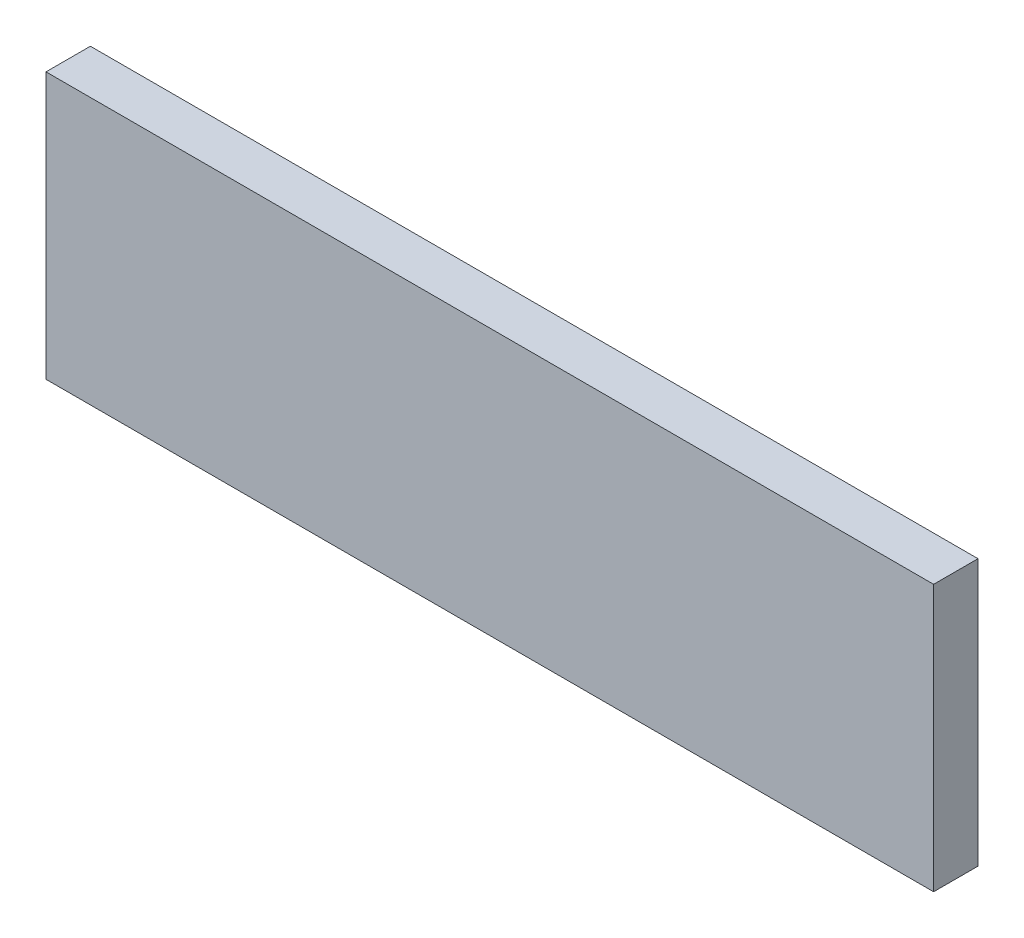
ISO-10303-21;
HEADER;
FILE_DESCRIPTION(('STEP AP214'),'2;1');
FILE_NAME('part.step','',(''),(''),'','','');
FILE_SCHEMA(('AUTOMOTIVE_DESIGN { 1 0 10303 214 1 1 1 1 }'));
ENDSEC;
DATA;
#1=APPLICATION_CONTEXT('core data for automotive mechanical design processes');
#2=APPLICATION_PROTOCOL_DEFINITION('international standard','automotive_design',2000,#1);
#3=PRODUCT_CONTEXT('',#1,'mechanical');
#4=PRODUCT('Part','Part','',(#3));
#5=PRODUCT_RELATED_PRODUCT_CATEGORY('part','',(#4));
#6=PRODUCT_DEFINITION_FORMATION('','',#4);
#7=PRODUCT_DEFINITION_CONTEXT('part definition',#1,'design');
#8=PRODUCT_DEFINITION('design','',#6,#7);
#9=PRODUCT_DEFINITION_SHAPE('','',#8);
#10=(LENGTH_UNIT() NAMED_UNIT(*) SI_UNIT(.MILLI.,.METRE.));
#11=(NAMED_UNIT(*) PLANE_ANGLE_UNIT() SI_UNIT($,.RADIAN.));
#12=(NAMED_UNIT(*) SI_UNIT($,.STERADIAN.) SOLID_ANGLE_UNIT());
#13=UNCERTAINTY_MEASURE_WITH_UNIT(LENGTH_MEASURE(1.E-05),#10,'distance_accuracy_value','');
#14=(GEOMETRIC_REPRESENTATION_CONTEXT(3) GLOBAL_UNCERTAINTY_ASSIGNED_CONTEXT((#13)) GLOBAL_UNIT_ASSIGNED_CONTEXT((#10,
#11,#12)) REPRESENTATION_CONTEXT('',''));
#15=CARTESIAN_POINT('',(0.,0.,0.));
#16=DIRECTION('',(0.,0.,1.));
#17=DIRECTION('',(1.,0.,0.));
#18=AXIS2_PLACEMENT_3D('',#15,#16,#17);
#19=CARTESIAN_POINT('',(-59.9567782068025,30.,-5.4538969513168));
#20=DIRECTION('',(1.,0.,0.));
#21=DIRECTION('',(0.,0.,-1.));
#22=AXIS2_PLACEMENT_3D('',#19,#20,#21);
#23=PLANE('',#22);
#24=DIRECTION('',(0.,0.,1.));
#25=VECTOR('',#24,1.);
#26=CARTESIAN_POINT('',(-59.9567782068025,0.,-5.4538969513168));
#27=LINE('',#26,#25);
#28=CARTESIAN_POINT('',(-59.9567782068025,0.,-5.4538969513168));
#29=VERTEX_POINT('',#28);
#30=CARTESIAN_POINT('',(-59.9567782068025,0.,-0.453896951316804));
#31=VERTEX_POINT('',#30);
#32=EDGE_CURVE('E102',#29,#31,#27,.T.);
#33=ORIENTED_EDGE('',*,*,#32,.T.);
#34=DIRECTION('',(0.,-1.,0.));
#35=VECTOR('',#34,1.);
#36=CARTESIAN_POINT('',(-59.9567782068025,30.,-0.453896951316804));
#37=LINE('',#36,#35);
#38=CARTESIAN_POINT('',(-59.9567782068025,30.,-0.453896951316804));
#39=VERTEX_POINT('',#38);
#40=EDGE_CURVE('E11',#39,#31,#37,.T.);
#41=ORIENTED_EDGE('',*,*,#40,.F.);
#42=DIRECTION('',(0.,0.,1.));
#43=VECTOR('',#42,1.);
#44=CARTESIAN_POINT('',(-59.9567782068025,30.,-5.4538969513168));
#45=LINE('',#44,#43);
#46=CARTESIAN_POINT('',(-59.9567782068025,30.,-5.4538969513168));
#47=VERTEX_POINT('',#46);
#48=EDGE_CURVE('E90',#47,#39,#45,.T.);
#49=ORIENTED_EDGE('',*,*,#48,.F.);
#50=DIRECTION('',(0.,-1.,0.));
#51=VECTOR('',#50,1.);
#52=CARTESIAN_POINT('',(-59.9567782068025,30.,-5.4538969513168));
#53=LINE('',#52,#51);
#54=EDGE_CURVE('E98',#47,#29,#53,.T.);
#55=ORIENTED_EDGE('',*,*,#54,.T.);
#56=EDGE_LOOP('',(#33,#41,#49,#55));
#57=FACE_BOUND('',#56,.T.);
#58=ADVANCED_FACE('F39',(#57),#23,.F.);
#59=CARTESIAN_POINT('',(-59.9567782068025,30.,-0.453896951316804));
#60=DIRECTION('',(0.,0.,-1.));
#61=DIRECTION('',(-1.,0.,0.));
#62=AXIS2_PLACEMENT_3D('',#59,#60,#61);
#63=PLANE('',#62);
#64=DIRECTION('',(1.,0.,0.));
#65=VECTOR('',#64,1.);
#66=CARTESIAN_POINT('',(-59.9567782068025,0.,-0.453896951316804));
#67=LINE('',#66,#65);
#68=CARTESIAN_POINT('',(40.0432217931975,0.,-0.453896951316804));
#69=VERTEX_POINT('',#68);
#70=EDGE_CURVE('E94',#31,#69,#67,.T.);
#71=ORIENTED_EDGE('',*,*,#70,.T.);
#72=DIRECTION('',(0.,-1.,0.));
#73=VECTOR('',#72,1.);
#74=CARTESIAN_POINT('',(40.0432217931975,30.,-0.453896951316804));
#75=LINE('',#74,#73);
#76=CARTESIAN_POINT('',(40.0432217931975,30.,-0.453896951316804));
#77=VERTEX_POINT('',#76);
#78=EDGE_CURVE('E47',#77,#69,#75,.T.);
#79=ORIENTED_EDGE('',*,*,#78,.F.);
#80=DIRECTION('',(1.,0.,0.));
#81=VECTOR('',#80,1.);
#82=CARTESIAN_POINT('',(-59.9567782068025,30.,-0.453896951316804));
#83=LINE('',#82,#81);
#84=EDGE_CURVE('E85',#39,#77,#83,.T.);
#85=ORIENTED_EDGE('',*,*,#84,.F.);
#86=ORIENTED_EDGE('',*,*,#40,.T.);
#87=EDGE_LOOP('',(#71,#79,#85,#86));
#88=FACE_BOUND('',#87,.T.);
#89=ADVANCED_FACE('F93',(#88),#63,.F.);
#90=CARTESIAN_POINT('',(40.0432217931975,30.,-5.4538969513168));
#91=DIRECTION('',(-1.,0.,0.));
#92=DIRECTION('',(0.,0.,1.));
#93=AXIS2_PLACEMENT_3D('',#90,#91,#92);
#94=PLANE('',#93);
#95=DIRECTION('',(0.,0.,-1.));
#96=VECTOR('',#95,1.);
#97=CARTESIAN_POINT('',(40.0432217931975,0.,-5.4538969513168));
#98=LINE('',#97,#96);
#99=CARTESIAN_POINT('',(40.0432217931975,0.,-5.4538969513168));
#100=VERTEX_POINT('',#99);
#101=EDGE_CURVE('E72',#69,#100,#98,.T.);
#102=ORIENTED_EDGE('',*,*,#101,.T.);
#103=DIRECTION('',(0.,-1.,0.));
#104=VECTOR('',#103,1.);
#105=CARTESIAN_POINT('',(40.0432217931975,30.,-5.4538969513168));
#106=LINE('',#105,#104);
#107=CARTESIAN_POINT('',(40.0432217931975,30.,-5.4538969513168));
#108=VERTEX_POINT('',#107);
#109=EDGE_CURVE('E95',#108,#100,#106,.T.);
#110=ORIENTED_EDGE('',*,*,#109,.F.);
#111=DIRECTION('',(0.,0.,-1.));
#112=VECTOR('',#111,1.);
#113=CARTESIAN_POINT('',(40.0432217931975,30.,-5.4538969513168));
#114=LINE('',#113,#112);
#115=EDGE_CURVE('E88',#77,#108,#114,.T.);
#116=ORIENTED_EDGE('',*,*,#115,.F.);
#117=ORIENTED_EDGE('',*,*,#78,.T.);
#118=EDGE_LOOP('',(#102,#110,#116,#117));
#119=FACE_BOUND('',#118,.T.);
#120=ADVANCED_FACE('F96',(#119),#94,.F.);
#121=CARTESIAN_POINT('',(-59.9567782068025,30.,-5.4538969513168));
#122=DIRECTION('',(0.,0.,1.));
#123=DIRECTION('',(1.,0.,0.));
#124=AXIS2_PLACEMENT_3D('',#121,#122,#123);
#125=PLANE('',#124);
#126=DIRECTION('',(-1.,0.,0.));
#127=VECTOR('',#126,1.);
#128=CARTESIAN_POINT('',(-59.9567782068025,0.,-5.4538969513168));
#129=LINE('',#128,#127);
#130=EDGE_CURVE('E78',#100,#29,#129,.T.);
#131=ORIENTED_EDGE('',*,*,#130,.T.);
#132=ORIENTED_EDGE('',*,*,#54,.F.);
#133=DIRECTION('',(-1.,0.,0.));
#134=VECTOR('',#133,1.);
#135=CARTESIAN_POINT('',(-59.9567782068025,30.,-5.4538969513168));
#136=LINE('',#135,#134);
#137=EDGE_CURVE('E55',#108,#47,#136,.T.);
#138=ORIENTED_EDGE('',*,*,#137,.F.);
#139=ORIENTED_EDGE('',*,*,#109,.T.);
#140=EDGE_LOOP('',(#131,#132,#138,#139));
#141=FACE_BOUND('',#140,.T.);
#142=ADVANCED_FACE('F109',(#141),#125,.F.);
#143=CARTESIAN_POINT('',(0.,30.,0.));
#144=DIRECTION('',(0.,1.,0.));
#145=DIRECTION('',(0.,0.,1.));
#146=AXIS2_PLACEMENT_3D('',#143,#144,#145);
#147=PLANE('',#146);
#148=ORIENTED_EDGE('',*,*,#48,.T.);
#149=ORIENTED_EDGE('',*,*,#84,.T.);
#150=ORIENTED_EDGE('',*,*,#115,.T.);
#151=ORIENTED_EDGE('',*,*,#137,.T.);
#152=EDGE_LOOP('',(#148,#149,#150,#151));
#153=FACE_BOUND('',#152,.T.);
#154=ADVANCED_FACE('F86',(#153),#147,.T.);
#155=CARTESIAN_POINT('',(0.,0.,0.));
#156=DIRECTION('',(0.,1.,0.));
#157=DIRECTION('',(0.,0.,1.));
#158=AXIS2_PLACEMENT_3D('',#155,#156,#157);
#159=PLANE('',#158);
#160=ORIENTED_EDGE('',*,*,#32,.F.);
#161=ORIENTED_EDGE('',*,*,#130,.F.);
#162=ORIENTED_EDGE('',*,*,#101,.F.);
#163=ORIENTED_EDGE('',*,*,#70,.F.);
#164=EDGE_LOOP('',(#160,#161,#162,#163));
#165=FACE_BOUND('',#164,.T.);
#166=ADVANCED_FACE('F112',(#165),#159,.F.);
#167=CLOSED_SHELL('',(#58,#89,#120,#142,#154,#166));
#168=MANIFOLD_SOLID_BREP('B2',#167);
#169=ADVANCED_BREP_SHAPE_REPRESENTATION('',(#18,#168),#14);
#170=SHAPE_DEFINITION_REPRESENTATION(#9,#169);
ENDSEC;
END-ISO-10303-21;
